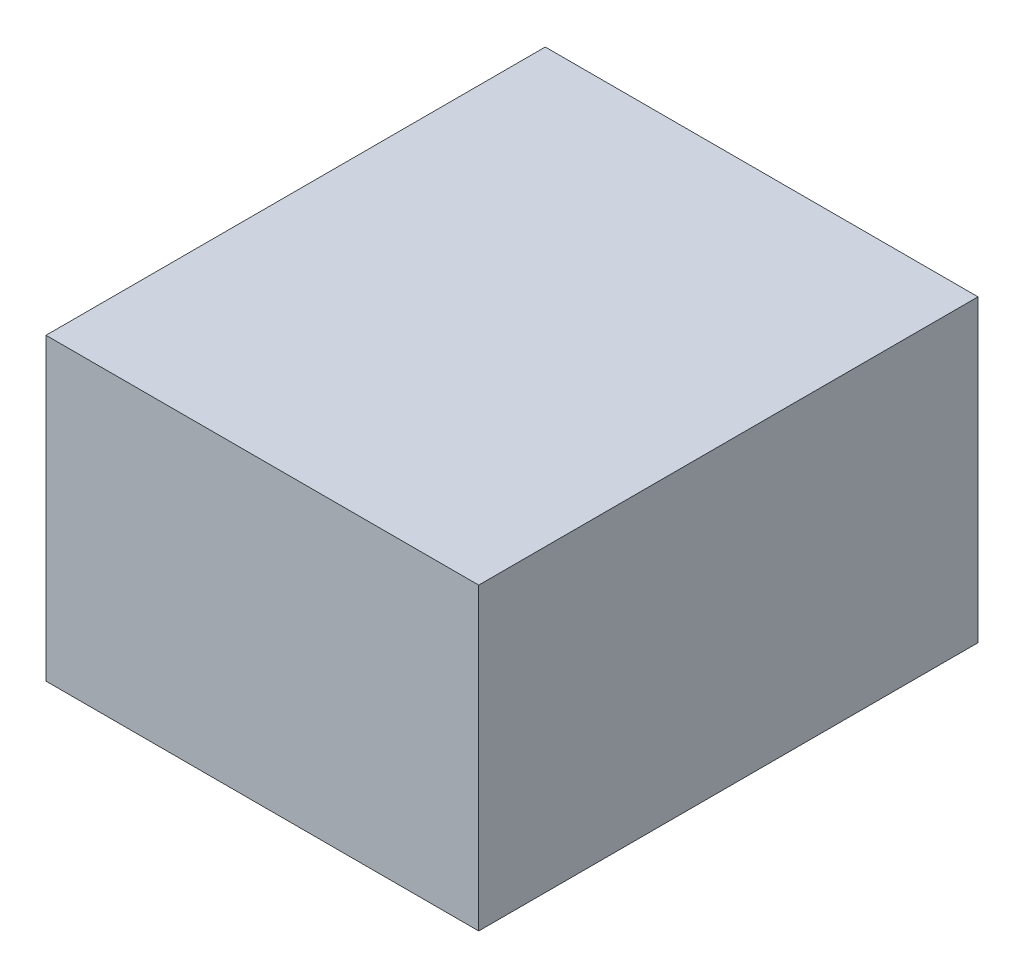
ISO-10303-21;
HEADER;
FILE_DESCRIPTION(('STEP AP214'),'2;1');
FILE_NAME('part.step','',(''),(''),'','','');
FILE_SCHEMA(('AUTOMOTIVE_DESIGN { 1 0 10303 214 1 1 1 1 }'));
ENDSEC;
DATA;
#1=APPLICATION_CONTEXT('core data for automotive mechanical design processes');
#2=APPLICATION_PROTOCOL_DEFINITION('international standard','automotive_design',2000,#1);
#3=PRODUCT_CONTEXT('',#1,'mechanical');
#4=PRODUCT('Part','Part','',(#3));
#5=PRODUCT_RELATED_PRODUCT_CATEGORY('part','',(#4));
#6=PRODUCT_DEFINITION_FORMATION('','',#4);
#7=PRODUCT_DEFINITION_CONTEXT('part definition',#1,'design');
#8=PRODUCT_DEFINITION('design','',#6,#7);
#9=PRODUCT_DEFINITION_SHAPE('','',#8);
#10=(LENGTH_UNIT() NAMED_UNIT(*) SI_UNIT(.MILLI.,.METRE.));
#11=(NAMED_UNIT(*) PLANE_ANGLE_UNIT() SI_UNIT($,.RADIAN.));
#12=(NAMED_UNIT(*) SI_UNIT($,.STERADIAN.) SOLID_ANGLE_UNIT());
#13=UNCERTAINTY_MEASURE_WITH_UNIT(LENGTH_MEASURE(1.E-05),#10,'distance_accuracy_value','');
#14=(GEOMETRIC_REPRESENTATION_CONTEXT(3) GLOBAL_UNCERTAINTY_ASSIGNED_CONTEXT((#13)) GLOBAL_UNIT_ASSIGNED_CONTEXT((#10,
#11,#12)) REPRESENTATION_CONTEXT('',''));
#15=CARTESIAN_POINT('',(0.,0.,0.));
#16=DIRECTION('',(0.,0.,1.));
#17=DIRECTION('',(1.,0.,0.));
#18=AXIS2_PLACEMENT_3D('',#15,#16,#17);
#19=CARTESIAN_POINT('',(22.8735083532219,18.,0.));
#20=DIRECTION('',(-1.,0.,0.));
#21=DIRECTION('',(0.,0.,1.));
#22=AXIS2_PLACEMENT_3D('',#19,#20,#21);
#23=PLANE('',#22);
#24=DIRECTION('',(0.,0.,-1.));
#25=VECTOR('',#24,1.);
#26=CARTESIAN_POINT('',(22.8735083532219,0.,0.));
#27=LINE('',#26,#25);
#28=CARTESIAN_POINT('',(22.8735083532219,0.,17.7923627684964));
#29=VERTEX_POINT('',#28);
#30=CARTESIAN_POINT('',(22.8735083532219,0.,-12.2076372315036));
#31=VERTEX_POINT('',#30);
#32=EDGE_CURVE('E114',#29,#31,#27,.T.);
#33=ORIENTED_EDGE('',*,*,#32,.T.);
#34=DIRECTION('',(0.,-1.,0.));
#35=VECTOR('',#34,1.);
#36=CARTESIAN_POINT('',(22.8735083532219,18.,-12.2076372315036));
#37=LINE('',#36,#35);
#38=CARTESIAN_POINT('',(22.8735083532219,18.,-12.2076372315036));
#39=VERTEX_POINT('',#38);
#40=EDGE_CURVE('E11',#39,#31,#37,.T.);
#41=ORIENTED_EDGE('',*,*,#40,.F.);
#42=DIRECTION('',(0.,0.,-1.));
#43=VECTOR('',#42,1.);
#44=CARTESIAN_POINT('',(22.8735083532219,18.,0.));
#45=LINE('',#44,#43);
#46=CARTESIAN_POINT('',(22.8735083532219,18.,17.7923627684964));
#47=VERTEX_POINT('',#46);
#48=EDGE_CURVE('E95',#47,#39,#45,.T.);
#49=ORIENTED_EDGE('',*,*,#48,.F.);
#50=DIRECTION('',(0.,-1.,0.));
#51=VECTOR('',#50,1.);
#52=CARTESIAN_POINT('',(22.8735083532219,18.,17.7923627684964));
#53=LINE('',#52,#51);
#54=EDGE_CURVE('E110',#47,#29,#53,.T.);
#55=ORIENTED_EDGE('',*,*,#54,.T.);
#56=EDGE_LOOP('',(#33,#41,#49,#55));
#57=FACE_BOUND('',#56,.T.);
#58=ADVANCED_FACE('F47',(#57),#23,.F.);
#59=CARTESIAN_POINT('',(0.,18.,-12.2076372315036));
#60=DIRECTION('',(0.,0.,1.));
#61=DIRECTION('',(1.,0.,0.));
#62=AXIS2_PLACEMENT_3D('',#59,#60,#61);
#63=PLANE('',#62);
#64=DIRECTION('',(-1.,0.,0.));
#65=VECTOR('',#64,1.);
#66=CARTESIAN_POINT('',(0.,0.,-12.2076372315036));
#67=LINE('',#66,#65);
#68=CARTESIAN_POINT('',(-3.12649164677805,0.,-12.2076372315036));
#69=VERTEX_POINT('',#68);
#70=EDGE_CURVE('E101',#31,#69,#67,.T.);
#71=ORIENTED_EDGE('',*,*,#70,.T.);
#72=DIRECTION('',(0.,-1.,0.));
#73=VECTOR('',#72,1.);
#74=CARTESIAN_POINT('',(-3.12649164677805,18.,-12.2076372315036));
#75=LINE('',#74,#73);
#76=CARTESIAN_POINT('',(-3.12649164677805,18.,-12.2076372315036));
#77=VERTEX_POINT('',#76);
#78=EDGE_CURVE('E56',#77,#69,#75,.T.);
#79=ORIENTED_EDGE('',*,*,#78,.F.);
#80=DIRECTION('',(-1.,0.,0.));
#81=VECTOR('',#80,1.);
#82=CARTESIAN_POINT('',(0.,18.,-12.2076372315036));
#83=LINE('',#82,#81);
#84=EDGE_CURVE('E90',#39,#77,#83,.T.);
#85=ORIENTED_EDGE('',*,*,#84,.F.);
#86=ORIENTED_EDGE('',*,*,#40,.T.);
#87=EDGE_LOOP('',(#71,#79,#85,#86));
#88=FACE_BOUND('',#87,.T.);
#89=ADVANCED_FACE('F100',(#88),#63,.F.);
#90=CARTESIAN_POINT('',(-3.12649164677805,18.,0.));
#91=DIRECTION('',(-1.,0.,0.));
#92=DIRECTION('',(0.,0.,1.));
#93=AXIS2_PLACEMENT_3D('',#90,#91,#92);
#94=PLANE('',#93);
#95=DIRECTION('',(0.,0.,-1.));
#96=VECTOR('',#95,1.);
#97=CARTESIAN_POINT('',(-3.12649164677805,0.,0.));
#98=LINE('',#97,#96);
#99=CARTESIAN_POINT('',(-3.12649164677805,0.,17.7923627684964));
#100=VERTEX_POINT('',#99);
#101=EDGE_CURVE('E120',#100,#69,#98,.T.);
#102=ORIENTED_EDGE('',*,*,#101,.F.);
#103=DIRECTION('',(0.,-1.,0.));
#104=VECTOR('',#103,1.);
#105=CARTESIAN_POINT('',(-3.12649164677805,18.,17.7923627684964));
#106=LINE('',#105,#104);
#107=CARTESIAN_POINT('',(-3.12649164677805,18.,17.7923627684964));
#108=VERTEX_POINT('',#107);
#109=EDGE_CURVE('E80',#108,#100,#106,.T.);
#110=ORIENTED_EDGE('',*,*,#109,.F.);
#111=DIRECTION('',(0.,0.,-1.));
#112=VECTOR('',#111,1.);
#113=CARTESIAN_POINT('',(-3.12649164677805,18.,0.));
#114=LINE('',#113,#112);
#115=EDGE_CURVE('E93',#108,#77,#114,.T.);
#116=ORIENTED_EDGE('',*,*,#115,.T.);
#117=ORIENTED_EDGE('',*,*,#78,.T.);
#118=EDGE_LOOP('',(#102,#110,#116,#117));
#119=FACE_BOUND('',#118,.T.);
#120=ADVANCED_FACE('F106',(#119),#94,.T.);
#121=CARTESIAN_POINT('',(0.,18.,17.7923627684964));
#122=DIRECTION('',(0.,0.,-1.));
#123=DIRECTION('',(-1.,0.,0.));
#124=AXIS2_PLACEMENT_3D('',#121,#122,#123);
#125=PLANE('',#124);
#126=DIRECTION('',(1.,0.,0.));
#127=VECTOR('',#126,1.);
#128=CARTESIAN_POINT('',(0.,0.,17.7923627684964));
#129=LINE('',#128,#127);
#130=EDGE_CURVE('E83',#100,#29,#129,.T.);
#131=ORIENTED_EDGE('',*,*,#130,.T.);
#132=ORIENTED_EDGE('',*,*,#54,.F.);
#133=DIRECTION('',(1.,0.,0.));
#134=VECTOR('',#133,1.);
#135=CARTESIAN_POINT('',(0.,18.,17.7923627684964));
#136=LINE('',#135,#134);
#137=EDGE_CURVE('E64',#108,#47,#136,.T.);
#138=ORIENTED_EDGE('',*,*,#137,.F.);
#139=ORIENTED_EDGE('',*,*,#109,.T.);
#140=EDGE_LOOP('',(#131,#132,#138,#139));
#141=FACE_BOUND('',#140,.T.);
#142=ADVANCED_FACE('F137',(#141),#125,.F.);
#143=CARTESIAN_POINT('',(0.,18.,0.));
#144=DIRECTION('',(0.,1.,0.));
#145=DIRECTION('',(0.,0.,1.));
#146=AXIS2_PLACEMENT_3D('',#143,#144,#145);
#147=PLANE('',#146);
#148=ORIENTED_EDGE('',*,*,#48,.T.);
#149=ORIENTED_EDGE('',*,*,#84,.T.);
#150=ORIENTED_EDGE('',*,*,#115,.F.);
#151=ORIENTED_EDGE('',*,*,#137,.T.);
#152=EDGE_LOOP('',(#148,#149,#150,#151));
#153=FACE_BOUND('',#152,.T.);
#154=ADVANCED_FACE('F91',(#153),#147,.T.);
#155=CARTESIAN_POINT('',(0.,0.,0.));
#156=DIRECTION('',(0.,1.,0.));
#157=DIRECTION('',(0.,0.,1.));
#158=AXIS2_PLACEMENT_3D('',#155,#156,#157);
#159=PLANE('',#158);
#160=ORIENTED_EDGE('',*,*,#32,.F.);
#161=ORIENTED_EDGE('',*,*,#130,.F.);
#162=ORIENTED_EDGE('',*,*,#101,.T.);
#163=ORIENTED_EDGE('',*,*,#70,.F.);
#164=EDGE_LOOP('',(#160,#161,#162,#163));
#165=FACE_BOUND('',#164,.T.);
#166=ADVANCED_FACE('F131',(#165),#159,.F.);
#167=CLOSED_SHELL('',(#58,#89,#120,#142,#154,#166));
#168=MANIFOLD_SOLID_BREP('B2',#167);
#169=ADVANCED_BREP_SHAPE_REPRESENTATION('',(#18,#168),#14);
#170=SHAPE_DEFINITION_REPRESENTATION(#9,#169);
ENDSEC;
END-ISO-10303-21;
